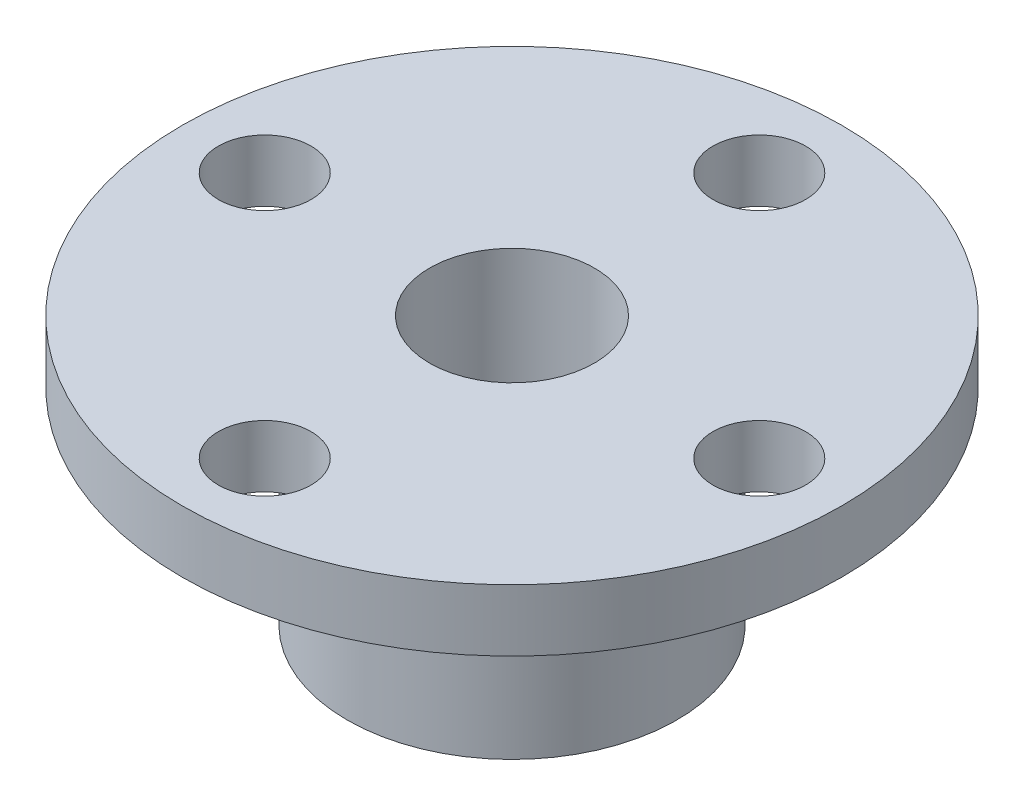
ISO-10303-21;
HEADER;
FILE_DESCRIPTION(('STEP AP214'),'2;1');
FILE_NAME('part.step','',(''),(''),'','','');
FILE_SCHEMA(('AUTOMOTIVE_DESIGN { 1 0 10303 214 1 1 1 1 }'));
ENDSEC;
DATA;
#1=APPLICATION_CONTEXT('core data for automotive mechanical design processes');
#2=APPLICATION_PROTOCOL_DEFINITION('international standard','automotive_design',2000,#1);
#3=PRODUCT_CONTEXT('',#1,'mechanical');
#4=PRODUCT('Part','Part','',(#3));
#5=PRODUCT_RELATED_PRODUCT_CATEGORY('part','',(#4));
#6=PRODUCT_DEFINITION_FORMATION('','',#4);
#7=PRODUCT_DEFINITION_CONTEXT('part definition',#1,'design');
#8=PRODUCT_DEFINITION('design','',#6,#7);
#9=PRODUCT_DEFINITION_SHAPE('','',#8);
#10=(LENGTH_UNIT() NAMED_UNIT(*) SI_UNIT(.MILLI.,.METRE.));
#11=(NAMED_UNIT(*) PLANE_ANGLE_UNIT() SI_UNIT($,.RADIAN.));
#12=(NAMED_UNIT(*) SI_UNIT($,.STERADIAN.) SOLID_ANGLE_UNIT());
#13=UNCERTAINTY_MEASURE_WITH_UNIT(LENGTH_MEASURE(1.E-05),#10,'distance_accuracy_value','');
#14=(GEOMETRIC_REPRESENTATION_CONTEXT(3) GLOBAL_UNCERTAINTY_ASSIGNED_CONTEXT((#13)) GLOBAL_UNIT_ASSIGNED_CONTEXT((#10,
#11,#12)) REPRESENTATION_CONTEXT('',''));
#15=CARTESIAN_POINT('',(0.,0.,0.));
#16=DIRECTION('',(0.,0.,1.));
#17=DIRECTION('',(1.,0.,0.));
#18=AXIS2_PLACEMENT_3D('',#15,#16,#17);
#19=CARTESIAN_POINT('',(0.,-5.,0.));
#20=DIRECTION('',(0.,1.,0.));
#21=DIRECTION('',(0.,0.,1.));
#22=AXIS2_PLACEMENT_3D('',#19,#20,#21);
#23=PLANE('',#22);
#24=CARTESIAN_POINT('',(0.,-5.,0.));
#25=DIRECTION('',(0.,1.,0.));
#26=DIRECTION('',(0.,0.,1.));
#27=AXIS2_PLACEMENT_3D('',#24,#25,#26);
#28=CIRCLE('',#27,8.);
#29=CARTESIAN_POINT('',(0.,-5.,8.));
#30=VERTEX_POINT('',#29);
#31=EDGE_CURVE('E45',#30,#30,#28,.T.);
#32=ORIENTED_EDGE('',*,*,#31,.F.);
#33=EDGE_LOOP('',(#32));
#34=FACE_BOUND('',#33,.T.);
#35=CARTESIAN_POINT('',(0.,-5.,0.));
#36=DIRECTION('',(0.,1.,0.));
#37=DIRECTION('',(0.,0.,1.));
#38=AXIS2_PLACEMENT_3D('',#35,#36,#37);
#39=CIRCLE('',#38,4.);
#40=CARTESIAN_POINT('',(0.,-5.,4.));
#41=VERTEX_POINT('',#40);
#42=EDGE_CURVE('E52',#41,#41,#39,.T.);
#43=ORIENTED_EDGE('',*,*,#42,.T.);
#44=EDGE_LOOP('',(#43));
#45=FACE_BOUND('',#44,.T.);
#46=ADVANCED_FACE('F40',(#34,#45),#23,.F.);
#47=CARTESIAN_POINT('',(0.,5.,0.));
#48=DIRECTION('',(0.,-1.,0.));
#49=DIRECTION('',(0.,0.,-1.));
#50=AXIS2_PLACEMENT_3D('',#47,#48,#49);
#51=CYLINDRICAL_SURFACE('',#50,8.);
#52=CARTESIAN_POINT('',(-7.82799463464303,0.,1.64999999999999));
#53=CARTESIAN_POINT('',(-7.82799647234762,-0.0916173497941295,1.64999668532493));
#54=CARTESIAN_POINT('',(-7.82962054015776,-0.183275814752847,1.64234339972764));
#55=CARTESIAN_POINT('',(-7.83593102109728,-0.363995369085821,1.61196056082935));
#56=CARTESIAN_POINT('',(-7.84061980768031,-0.453054389446515,1.58921932254547));
#57=CARTESIAN_POINT('',(-7.85250661788931,-0.625934492204627,1.52939944297714));
#58=CARTESIAN_POINT('',(-7.85970206178508,-0.709760855612775,1.49233553761891));
#59=CARTESIAN_POINT('',(-7.8757883628587,-0.870004602264868,1.40496339378156));
#60=CARTESIAN_POINT('',(-7.88467914491256,-0.946422313575551,1.35465574212316));
#61=CARTESIAN_POINT('',(-7.90330366333984,-1.09083130314561,1.24141806188275));
#62=CARTESIAN_POINT('',(-7.91304715328143,-1.15869500128047,1.17832691131059));
#63=CARTESIAN_POINT('',(-7.93219354684102,-1.28295461376032,1.04166118718968));
#64=CARTESIAN_POINT('',(-7.9415964257225,-1.33934969657567,0.968085854144701));
#65=CARTESIAN_POINT('',(-7.95910768239297,-1.43956942635827,0.811692001393454));
#66=CARTESIAN_POINT('',(-7.9672032148807,-1.48327235381807,0.728793920101064));
#67=CARTESIAN_POINT('',(-7.98107786735649,-1.55608110943423,0.556636173632879));
#68=CARTESIAN_POINT('',(-7.9868572180665,-1.58518839158008,0.467377143134516));
#69=CARTESIAN_POINT('',(-7.99537941797959,-1.62758111250497,0.286356118265319));
#70=CARTESIAN_POINT('',(-7.99816360714569,-1.64108215209675,0.194646593521389));
#71=CARTESIAN_POINT('',(-8.00052470522147,-1.65255227142173,0.010224791921826));
#72=CARTESIAN_POINT('',(-8.00010194196704,-1.65052293877214,-0.0824873814688684));
#73=CARTESIAN_POINT('',(-7.9961286601365,-1.63115248809589,-0.264799667160884));
#74=CARTESIAN_POINT('',(-7.99262559257093,-1.61404365512093,-0.35442564460906));
#75=CARTESIAN_POINT('',(-7.98293899531616,-1.5653688535758,-0.529506535845924));
#76=CARTESIAN_POINT('',(-7.97675535366161,-1.53380228111471,-0.614961275239551));
#77=CARTESIAN_POINT('',(-7.96232481023259,-1.45689604030914,-0.779930808135333));
#78=CARTESIAN_POINT('',(-7.95406448397429,-1.411466330109,-0.859402403191199));
#79=CARTESIAN_POINT('',(-7.93638961806161,-1.30819018594217,-1.00967984091354));
#80=CARTESIAN_POINT('',(-7.92697493766869,-1.25034223730045,-1.08048462481769));
#81=CARTESIAN_POINT('',(-7.9078239642189,-1.12260050730487,-1.21279807501824));
#82=CARTESIAN_POINT('',(-7.89808494418976,-1.05250342398988,-1.27411022634264));
#83=CARTESIAN_POINT('',(-7.87954771497238,-0.902922954740923,-1.38414252261934));
#84=CARTESIAN_POINT('',(-7.87074952591437,-0.823439368047681,-1.43286239817597));
#85=CARTESIAN_POINT('',(-7.85508413098618,-0.657048454677042,-1.51640121308694));
#86=CARTESIAN_POINT('',(-7.84822159457677,-0.570123824446947,-1.55118662114807));
#87=CARTESIAN_POINT('',(-7.83727167258975,-0.391488891774126,-1.60559987539904));
#88=CARTESIAN_POINT('',(-7.83318390018328,-0.299779258327424,-1.62522983445703));
#89=CARTESIAN_POINT('',(-7.82832430034404,-0.11596343547278,-1.64847767759947));
#90=CARTESIAN_POINT('',(-7.82749355348184,-0.023894750850637,-1.65238010858406));
#91=CARTESIAN_POINT('',(-7.8290836566982,0.159577873693995,-1.64482933127385));
#92=CARTESIAN_POINT('',(-7.83150430988348,0.250981853531663,-1.63337705280605));
#93=CARTESIAN_POINT('',(-7.83926913983493,0.429562925706313,-1.59568777426686));
#94=CARTESIAN_POINT('',(-7.84458293687796,0.516773866309524,-1.56960432546508));
#95=CARTESIAN_POINT('',(-7.85750843647708,0.685587763262813,-1.50355797289372));
#96=CARTESIAN_POINT('',(-7.8651203384623,0.767190232155915,-1.46359386451765));
#97=CARTESIAN_POINT('',(-7.88191579950282,0.923711451842274,-1.37028211396986));
#98=CARTESIAN_POINT('',(-7.89111960565472,0.998522375495671,-1.31675731908659));
#99=CARTESIAN_POINT('',(-7.91000699478186,1.13820452380131,-1.19807829347332));
#100=CARTESIAN_POINT('',(-7.91969063034348,1.20307465580095,-1.1329227860428));
#101=CARTESIAN_POINT('',(-7.93863877717957,1.32212093769425,-0.991551131023629));
#102=CARTESIAN_POINT('',(-7.94789380519354,1.37610416985807,-0.915171051258587));
#103=CARTESIAN_POINT('',(-7.96477402593325,1.47047228277745,-0.754260738130266));
#104=CARTESIAN_POINT('',(-7.97239928979603,1.51085775710128,-0.669730860728579));
#105=CARTESIAN_POINT('',(-7.98512048804082,1.57660680591843,-0.495414150876534));
#106=CARTESIAN_POINT('',(-7.99023131933467,1.60205903076799,-0.405661891513269));
#107=CARTESIAN_POINT('',(-7.99741186635557,1.63749875247808,-0.223039444294585));
#108=CARTESIAN_POINT('',(-7.99948197278732,1.64748823616509,-0.130169658580921));
#109=CARTESIAN_POINT('',(-8.00033781964049,1.65163792775637,0.0542126492055747));
#110=CARTESIAN_POINT('',(-7.99918360281958,1.64608751248278,0.145718502140299));
#111=CARTESIAN_POINT('',(-7.99384751004402,1.61995660490955,0.326463478938167));
#112=CARTESIAN_POINT('',(-7.98966567723011,1.59937632677157,0.415702635080897));
#113=CARTESIAN_POINT('',(-7.97874682116246,1.5439018588418,0.589186560182794));
#114=CARTESIAN_POINT('',(-7.97201637401338,1.509044489013,0.673443542985805));
#115=CARTESIAN_POINT('',(-7.95672300876336,1.42604295789362,0.834953513276949));
#116=CARTESIAN_POINT('',(-7.9481599348062,1.37789766642748,0.912205904261776));
#117=CARTESIAN_POINT('',(-7.92995681960444,1.26872135471439,1.05893847166513));
#118=CARTESIAN_POINT('',(-7.92030089151861,1.20748443024996,1.12826349060999));
#119=CARTESIAN_POINT('',(-7.90109178015231,1.07428375835354,1.25575285452552));
#120=CARTESIAN_POINT('',(-7.89153862187157,1.00231746145462,1.31391453937944));
#121=CARTESIAN_POINT('',(-7.8734942340194,0.848698896172095,1.41807001635073));
#122=CARTESIAN_POINT('',(-7.86501660134749,0.76694399769159,1.46391490783103));
#123=CARTESIAN_POINT('',(-7.85025069483304,0.596737113830858,1.54114313624576));
#124=CARTESIAN_POINT('',(-7.84396047891661,0.508291154433198,1.57253930936729));
#125=CARTESIAN_POINT('',(-7.83550744278865,0.349732775697689,1.61404620798977));
#126=CARTESIAN_POINT('',(-7.83270799535493,0.280511051598966,1.62750420424828));
#127=CARTESIAN_POINT('',(-7.82895092043294,0.140867623455348,1.64548220150438));
#128=CARTESIAN_POINT('',(-7.82799322160417,0.0704459659967139,1.65000254870379));
#129=CARTESIAN_POINT('',(-7.82799463464303,0.,1.64999999999999));
#130=B_SPLINE_CURVE_WITH_KNOTS('',3,(#52,#53,#54,#55,#56,#57,#58,#59,#60,#61,#62,#63,#64,#65,
#66,#67,#68,#69,#70,#71,#72,#73,#74,#75,#76,#77,#78,#79,#80,#81,#82,#83,#84,#85,#86,#87,#88,#89,
#90,#91,#92,#93,#94,#95,#96,#97,#98,#99,#100,#101,#102,#103,#104,#105,#106,#107,#108,#109,#110,
#111,#112,#113,#114,#115,#116,#117,#118,#119,#120,#121,#122,#123,#124,#125,#126,#127,#128,#129),
.UNSPECIFIED.,.T.,.F.,(4,2,2,2,2,2,2,2,2,2,2,2,2,2,2,2,2,2,2,2,2,2,2,2,2,2,2,2,2,2,2,2,2,2,2,2,
2,2,4),(0.,0.274594036981749,0.549400984088786,0.823925944657621,1.09843874327276,
1.3766547467594,1.65489091505464,1.93571338943598,2.21650788327397,2.49337499570617,
2.77021380533169,3.04286128513493,3.31552015429503,3.58998907522695,3.86449149267072,
4.14407920367273,4.4236728956019,4.70393540521657,4.9841588355065,5.25928898855093,
5.53440248143716,5.80668132243981,6.07898379854718,6.35504561674318,6.6311377568341,
6.91175972338565,7.19236943866019,7.47129602001294,7.75018675877315,8.02391884651822,
8.29764703391013,8.57067368982019,8.84372357458458,9.1214337806041,9.39921008040027,
9.68020708192079,9.96095396255218,10.1721016499172,10.38324115827),.UNSPECIFIED.);
#131=CARTESIAN_POINT('',(-7.82799463464303,0.,1.64999999999999));
#132=VERTEX_POINT('',#131);
#133=EDGE_CURVE('E65',#132,#132,#130,.T.);
#134=ORIENTED_EDGE('',*,*,#133,.T.);
#135=EDGE_LOOP('',(#134));
#136=FACE_BOUND('',#135,.T.);
#137=CARTESIAN_POINT('',(0.,5.,0.));
#138=DIRECTION('',(0.,1.,0.));
#139=DIRECTION('',(0.,0.,1.));
#140=AXIS2_PLACEMENT_3D('',#137,#138,#139);
#141=CIRCLE('',#140,8.);
#142=CARTESIAN_POINT('',(0.,5.,8.));
#143=VERTEX_POINT('',#142);
#144=EDGE_CURVE('E10',#143,#143,#141,.T.);
#145=ORIENTED_EDGE('',*,*,#144,.F.);
#146=EDGE_LOOP('',(#145));
#147=FACE_BOUND('',#146,.T.);
#148=ORIENTED_EDGE('',*,*,#31,.T.);
#149=EDGE_LOOP('',(#148));
#150=FACE_BOUND('',#149,.T.);
#151=ADVANCED_FACE('F42',(#136,#147,#150),#51,.T.);
#152=CARTESIAN_POINT('',(0.,5.,0.));
#153=DIRECTION('',(0.,-1.,0.));
#154=DIRECTION('',(0.,0.,-1.));
#155=AXIS2_PLACEMENT_3D('',#152,#153,#154);
#156=CYLINDRICAL_SURFACE('',#155,4.);
#157=CARTESIAN_POINT('',(-3.64383040220041,0.,1.64999999999999));
#158=CARTESIAN_POINT('',(-3.64383945275153,-0.0880964802256832,1.64999056813102));
#159=CARTESIAN_POINT('',(-3.64707173267573,-0.176340431973593,1.64289989177357));
#160=CARTESIAN_POINT('',(-3.65959209124688,-0.350287061078879,1.61480845546373));
#161=CARTESIAN_POINT('',(-3.66889676295875,-0.435982100597602,1.59376957896339));
#162=CARTESIAN_POINT('',(-3.69231325052126,-0.602002938130631,1.53873536249637));
#163=CARTESIAN_POINT('',(-3.70640571161012,-0.682348820218596,1.50479212400173));
#164=CARTESIAN_POINT('',(-3.73778230052357,-0.836181766834222,1.42506535594206));
#165=CARTESIAN_POINT('',(-3.75506562873473,-0.909670542784033,1.37928479159595));
#166=CARTESIAN_POINT('',(-3.7920553041855,-1.0522286878465,1.27419856290371));
#167=CARTESIAN_POINT('',(-3.81184277704779,-1.1208292557802,1.21428518241359));
#168=CARTESIAN_POINT('',(-3.85094363418238,-1.24735477190876,1.08391072165482));
#169=CARTESIAN_POINT('',(-3.87025683535296,-1.30527565147222,1.01344563996364));
#170=CARTESIAN_POINT('',(-3.90721575035942,-1.41117137130186,0.860301943593378));
#171=CARTESIAN_POINT('',(-3.92475616703248,-1.45862093270615,0.777232390113587));
#172=CARTESIAN_POINT('',(-3.95520283117798,-1.5386701453217,0.603436361875854));
#173=CARTESIAN_POINT('',(-3.96811109652272,-1.57127626434656,0.512713242513042));
#174=CARTESIAN_POINT('',(-3.98726403378776,-1.61902070665622,0.331105172304396));
#175=CARTESIAN_POINT('',(-3.99381564337609,-1.63496684792323,0.24046562518449));
#176=CARTESIAN_POINT('',(-4.0006306156112,-1.65154665185517,0.057576355149864));
#177=CARTESIAN_POINT('',(-4.00089647540932,-1.65218639532201,-0.0346727137709561));
#178=CARTESIAN_POINT('',(-3.99529224160632,-1.6385635038634,-0.212297380895986));
#179=CARTESIAN_POINT('',(-3.98978733384658,-1.6251878162829,-0.297754665400397));
#180=CARTESIAN_POINT('',(-3.97375926025944,-1.58543118255224,-0.465085845235279));
#181=CARTESIAN_POINT('',(-3.96323572489496,-1.55904927870932,-0.546959476205492));
#182=CARTESIAN_POINT('',(-3.93798907731603,-1.49371233827982,-0.706295606817228));
#183=CARTESIAN_POINT('',(-3.92320447216362,-1.45457201007513,-0.783671979762468));
#184=CARTESIAN_POINT('',(-3.89088763760773,-1.36500872081339,-0.930960489992464));
#185=CARTESIAN_POINT('',(-3.87335444442337,-1.31458179949669,-1.00086999453932));
#186=CARTESIAN_POINT('',(-3.83587133640027,-1.19981176097136,-1.1363853094704));
#187=CARTESIAN_POINT('',(-3.8158381454309,-1.13474658910127,-1.20135746318645));
#188=CARTESIAN_POINT('',(-3.77653142784555,-0.994590333678423,-1.31973838423493));
#189=CARTESIAN_POINT('',(-3.75725818494773,-0.919495550736696,-1.37314286572201));
#190=CARTESIAN_POINT('',(-3.7210660715691,-0.758401596452683,-1.46845339844828));
#191=CARTESIAN_POINT('',(-3.70424107982558,-0.672132428307348,-1.50994179309276));
#192=CARTESIAN_POINT('',(-3.67596385006486,-0.492953328594103,-1.57754508127095));
#193=CARTESIAN_POINT('',(-3.66450786071418,-0.400048086126183,-1.60367071206121));
#194=CARTESIAN_POINT('',(-3.64919091711419,-0.216577104815015,-1.63821320355941));
#195=CARTESIAN_POINT('',(-3.64489111171832,-0.12624169881714,-1.64765569454681));
#196=CARTESIAN_POINT('',(-3.64311980380968,0.0548056296985975,-1.65157101672826));
#197=CARTESIAN_POINT('',(-3.6456460160745,0.145517416059282,-1.64604885780401));
#198=CARTESIAN_POINT('',(-3.65678944366161,0.31880100904947,-1.62112710501826));
#199=CARTESIAN_POINT('',(-3.66501803861665,0.401528179674606,-1.60261202118542));
#200=CARTESIAN_POINT('',(-3.68614612916707,0.56263706437997,-1.55339580262014));
#201=CARTESIAN_POINT('',(-3.69904670212357,0.641017771351657,-1.52269185697123));
#202=CARTESIAN_POINT('',(-3.72872477858183,0.794879005695635,-1.44853902204984));
#203=CARTESIAN_POINT('',(-3.74564214050945,0.870100194779243,-1.40460979308263));
#204=CARTESIAN_POINT('',(-3.78124523189864,1.01246016942973,-1.30573455409451));
#205=CARTESIAN_POINT('',(-3.79993171387674,1.07959548773512,-1.25078384473683));
#206=CARTESIAN_POINT('',(-3.83876011670653,1.20942962644671,-1.12627542162098));
#207=CARTESIAN_POINT('',(-3.85889967217623,1.27135173704871,-1.05590387126703));
#208=CARTESIAN_POINT('',(-3.89698114804694,1.38264285566206,-0.9052979800801));
#209=CARTESIAN_POINT('',(-3.91492292631237,1.43201105200319,-0.8250630020269));
#210=CARTESIAN_POINT('',(-3.94668767391886,1.51670413420678,-0.656516816883264));
#211=CARTESIAN_POINT('',(-3.96050313975064,1.55200347500272,-0.568191273870488));
#212=CARTESIAN_POINT('',(-3.98237104121021,1.60699165685874,-0.386140833605175));
#213=CARTESIAN_POINT('',(-3.9904268305481,1.62668958293893,-0.292419112817558));
#214=CARTESIAN_POINT('',(-3.9994889299446,1.64878822892048,-0.109187189544834));
#215=CARTESIAN_POINT('',(-4.00094173424749,1.65228482874193,-0.019830308118634));
#216=CARTESIAN_POINT('',(-3.99786220239438,1.64481456562971,0.158161739195412));
#217=CARTESIAN_POINT('',(-3.99333087896147,1.63385015000454,0.24679702464848));
#218=CARTESIAN_POINT('',(-3.979024148364,1.59855535786443,0.417705375935875));
#219=CARTESIAN_POINT('',(-3.96943363922013,1.57469555788544,0.50009237162785));
#220=CARTESIAN_POINT('',(-3.94605480923816,1.51479588512,0.659667355734158));
#221=CARTESIAN_POINT('',(-3.93226568297163,1.47875367521331,0.736854343148742));
#222=CARTESIAN_POINT('',(-3.90105808483759,1.39369547331361,0.887661133732617));
#223=CARTESIAN_POINT('',(-3.8835042391169,1.34416874322707,0.960964214361148));
#224=CARTESIAN_POINT('',(-3.84685709666619,1.23429715321,1.09852932170704));
#225=CARTESIAN_POINT('',(-3.82776324400832,1.17394837691919,1.1627880603165));
#226=CARTESIAN_POINT('',(-3.78859741195738,1.03941247264534,1.28487769945047));
#227=CARTESIAN_POINT('',(-3.76854475207572,0.964572243115057,1.34199767947156));
#228=CARTESIAN_POINT('',(-3.73105419200534,0.805734024318929,1.4429647467733));
#229=CARTESIAN_POINT('',(-3.7136177396712,0.721731008290406,1.48680449811903));
#230=CARTESIAN_POINT('',(-3.68370387904713,0.547271558730101,1.55944447766651));
#231=CARTESIAN_POINT('',(-3.67119480418034,0.4568608919089,1.58834112875233));
#232=CARTESIAN_POINT('',(-3.65281837075147,0.271952855921639,1.63017263567572));
#233=CARTESIAN_POINT('',(-3.64692873900432,0.177470309123126,1.64316103312974));
#234=CARTESIAN_POINT('',(-3.6441405441978,0.0551366863573538,1.64931209329419));
#235=CARTESIAN_POINT('',(-3.64382756923723,0.0275755677149814,1.6500029523216));
#236=CARTESIAN_POINT('',(-3.64383040220041,0.,1.64999999999999));
#237=B_SPLINE_CURVE_WITH_KNOTS('',3,(#157,#158,#159,#160,#161,#162,#163,#164,#165,#166,#167,
#168,#169,#170,#171,#172,#173,#174,#175,#176,#177,#178,#179,#180,#181,#182,#183,#184,#185,#186,
#187,#188,#189,#190,#191,#192,#193,#194,#195,#196,#197,#198,#199,#200,#201,#202,#203,#204,#205,
#206,#207,#208,#209,#210,#211,#212,#213,#214,#215,#216,#217,#218,#219,#220,#221,#222,#223,#224,
#225,#226,#227,#228,#229,#230,#231,#232,#233,#234,#235,#236),.UNSPECIFIED.,.T.,.F.,(4,2,2,2,2,2,
2,2,2,2,2,2,2,2,2,2,2,2,2,2,2,2,2,2,2,2,2,2,2,2,2,2,2,2,2,2,2,2,2,4),(0.,0.264211724660743,
0.529148459018596,0.793026677872046,1.05683885985755,1.33523297260791,1.61373292676209,
1.90403076094908,2.19420198072698,2.46953816244269,2.74476495901023,3.00356896819765,
3.2623920368679,3.52515526924739,3.78801084539544,4.06907613148063,4.35024537535723,
4.64031806272422,4.93018777241109,5.20152035698261,5.4727621157604,5.72713321026164,
5.98156300028879,6.24665916965706,6.51186861189121,6.79815687284344,7.08446363898861,
7.37128791456168,7.65794504349148,7.92489841526077,8.19180661499932,8.44957452423756,
8.70739191275385,8.97680852354692,9.24632283025304,9.53374725602172,9.82133016535512,
10.1070334851925,10.3917725616093,10.4744749384331),.UNSPECIFIED.);
#238=CARTESIAN_POINT('',(-3.64383040220041,0.,1.64999999999999));
#239=VERTEX_POINT('',#238);
#240=EDGE_CURVE('E72',#239,#239,#237,.T.);
#241=ORIENTED_EDGE('',*,*,#240,.F.);
#242=EDGE_LOOP('',(#241));
#243=FACE_BOUND('',#242,.T.);
#244=ORIENTED_EDGE('',*,*,#42,.F.);
#245=EDGE_LOOP('',(#244));
#246=FACE_BOUND('',#245,.T.);
#247=CARTESIAN_POINT('',(0.,8.,0.));
#248=DIRECTION('',(0.,1.,0.));
#249=DIRECTION('',(0.,0.,1.));
#250=AXIS2_PLACEMENT_3D('',#247,#248,#249);
#251=CIRCLE('',#250,4.);
#252=CARTESIAN_POINT('',(0.,8.,4.));
#253=VERTEX_POINT('',#252);
#254=EDGE_CURVE('E60',#253,#253,#251,.T.);
#255=ORIENTED_EDGE('',*,*,#254,.T.);
#256=EDGE_LOOP('',(#255));
#257=FACE_BOUND('',#256,.T.);
#258=ADVANCED_FACE('F93',(#243,#246,#257),#156,.F.);
#259=CARTESIAN_POINT('',(0.,8.,0.));
#260=DIRECTION('',(0.,1.,0.));
#261=DIRECTION('',(0.,0.,1.));
#262=AXIS2_PLACEMENT_3D('',#259,#260,#261);
#263=PLANE('',#262);
#264=CARTESIAN_POINT('',(0.,8.,-12.));
#265=DIRECTION('',(0.,1.,0.));
#266=DIRECTION('',(0.,0.,1.));
#267=AXIS2_PLACEMENT_3D('',#264,#265,#266);
#268=CIRCLE('',#267,2.25);
#269=CARTESIAN_POINT('',(0.,8.,-9.75));
#270=VERTEX_POINT('',#269);
#271=EDGE_CURVE('E214',#270,#270,#268,.T.);
#272=ORIENTED_EDGE('',*,*,#271,.F.);
#273=EDGE_LOOP('',(#272));
#274=FACE_BOUND('',#273,.T.);
#275=CARTESIAN_POINT('',(12.,8.,0.));
#276=DIRECTION('',(0.,1.,0.));
#277=DIRECTION('',(0.,0.,1.));
#278=AXIS2_PLACEMENT_3D('',#275,#276,#277);
#279=CIRCLE('',#278,2.25);
#280=CARTESIAN_POINT('',(12.,8.,2.25));
#281=VERTEX_POINT('',#280);
#282=EDGE_CURVE('E216',#281,#281,#279,.T.);
#283=ORIENTED_EDGE('',*,*,#282,.F.);
#284=EDGE_LOOP('',(#283));
#285=FACE_BOUND('',#284,.T.);
#286=CARTESIAN_POINT('',(-12.,8.,0.));
#287=DIRECTION('',(0.,1.,0.));
#288=DIRECTION('',(0.,0.,1.));
#289=AXIS2_PLACEMENT_3D('',#286,#287,#288);
#290=CIRCLE('',#289,2.25);
#291=CARTESIAN_POINT('',(-12.,8.,2.25));
#292=VERTEX_POINT('',#291);
#293=EDGE_CURVE('E224',#292,#292,#290,.T.);
#294=ORIENTED_EDGE('',*,*,#293,.F.);
#295=EDGE_LOOP('',(#294));
#296=FACE_BOUND('',#295,.T.);
#297=CARTESIAN_POINT('',(0.,8.,12.));
#298=DIRECTION('',(0.,1.,0.));
#299=DIRECTION('',(0.,0.,1.));
#300=AXIS2_PLACEMENT_3D('',#297,#298,#299);
#301=CIRCLE('',#300,2.25);
#302=CARTESIAN_POINT('',(0.,8.,14.25));
#303=VERTEX_POINT('',#302);
#304=EDGE_CURVE('E230',#303,#303,#301,.T.);
#305=ORIENTED_EDGE('',*,*,#304,.F.);
#306=EDGE_LOOP('',(#305));
#307=FACE_BOUND('',#306,.T.);
#308=CARTESIAN_POINT('',(0.,8.,0.));
#309=DIRECTION('',(0.,1.,0.));
#310=DIRECTION('',(0.,0.,1.));
#311=AXIS2_PLACEMENT_3D('',#308,#309,#310);
#312=CIRCLE('',#311,16.);
#313=CARTESIAN_POINT('',(0.,8.,16.));
#314=VERTEX_POINT('',#313);
#315=EDGE_CURVE('E56',#314,#314,#312,.T.);
#316=ORIENTED_EDGE('',*,*,#315,.T.);
#317=EDGE_LOOP('',(#316));
#318=FACE_BOUND('',#317,.T.);
#319=ORIENTED_EDGE('',*,*,#254,.F.);
#320=EDGE_LOOP('',(#319));
#321=FACE_BOUND('',#320,.T.);
#322=ADVANCED_FACE('F89',(#274,#285,#296,#307,#318,#321),#263,.T.);
#323=CARTESIAN_POINT('',(0.,5.,0.));
#324=DIRECTION('',(0.,1.,0.));
#325=DIRECTION('',(0.,0.,1.));
#326=AXIS2_PLACEMENT_3D('',#323,#324,#325);
#327=PLANE('',#326);
#328=CARTESIAN_POINT('',(0.,5.,-12.));
#329=DIRECTION('',(0.,1.,0.));
#330=DIRECTION('',(0.,0.,1.));
#331=AXIS2_PLACEMENT_3D('',#328,#329,#330);
#332=CIRCLE('',#331,2.25);
#333=CARTESIAN_POINT('',(0.,5.,-9.75));
#334=VERTEX_POINT('',#333);
#335=EDGE_CURVE('E211',#334,#334,#332,.T.);
#336=ORIENTED_EDGE('',*,*,#335,.T.);
#337=EDGE_LOOP('',(#336));
#338=FACE_BOUND('',#337,.T.);
#339=CARTESIAN_POINT('',(12.,5.,0.));
#340=DIRECTION('',(0.,1.,0.));
#341=DIRECTION('',(0.,0.,1.));
#342=AXIS2_PLACEMENT_3D('',#339,#340,#341);
#343=CIRCLE('',#342,2.25);
#344=CARTESIAN_POINT('',(12.,5.,2.25));
#345=VERTEX_POINT('',#344);
#346=EDGE_CURVE('E221',#345,#345,#343,.T.);
#347=ORIENTED_EDGE('',*,*,#346,.T.);
#348=EDGE_LOOP('',(#347));
#349=FACE_BOUND('',#348,.T.);
#350=CARTESIAN_POINT('',(-12.,5.,0.));
#351=DIRECTION('',(0.,1.,0.));
#352=DIRECTION('',(0.,0.,1.));
#353=AXIS2_PLACEMENT_3D('',#350,#351,#352);
#354=CIRCLE('',#353,2.25);
#355=CARTESIAN_POINT('',(-12.,5.,2.25));
#356=VERTEX_POINT('',#355);
#357=EDGE_CURVE('E227',#356,#356,#354,.T.);
#358=ORIENTED_EDGE('',*,*,#357,.T.);
#359=EDGE_LOOP('',(#358));
#360=FACE_BOUND('',#359,.T.);
#361=CARTESIAN_POINT('',(0.,5.,12.));
#362=DIRECTION('',(0.,1.,0.));
#363=DIRECTION('',(0.,0.,1.));
#364=AXIS2_PLACEMENT_3D('',#361,#362,#363);
#365=CIRCLE('',#364,2.25);
#366=CARTESIAN_POINT('',(0.,5.,14.25));
#367=VERTEX_POINT('',#366);
#368=EDGE_CURVE('E232',#367,#367,#365,.T.);
#369=ORIENTED_EDGE('',*,*,#368,.T.);
#370=EDGE_LOOP('',(#369));
#371=FACE_BOUND('',#370,.T.);
#372=ORIENTED_EDGE('',*,*,#144,.T.);
#373=EDGE_LOOP('',(#372));
#374=FACE_BOUND('',#373,.T.);
#375=CARTESIAN_POINT('',(0.,5.,0.));
#376=DIRECTION('',(0.,1.,0.));
#377=DIRECTION('',(0.,0.,1.));
#378=AXIS2_PLACEMENT_3D('',#375,#376,#377);
#379=CIRCLE('',#378,16.);
#380=CARTESIAN_POINT('',(0.,5.,16.));
#381=VERTEX_POINT('',#380);
#382=EDGE_CURVE('E57',#381,#381,#379,.T.);
#383=ORIENTED_EDGE('',*,*,#382,.F.);
#384=EDGE_LOOP('',(#383));
#385=FACE_BOUND('',#384,.T.);
#386=ADVANCED_FACE('F92',(#338,#349,#360,#371,#374,#385),#327,.F.);
#387=CARTESIAN_POINT('',(0.,8.,0.));
#388=DIRECTION('',(0.,-1.,0.));
#389=DIRECTION('',(0.,0.,-1.));
#390=AXIS2_PLACEMENT_3D('',#387,#388,#389);
#391=CYLINDRICAL_SURFACE('',#390,16.);
#392=ORIENTED_EDGE('',*,*,#315,.F.);
#393=EDGE_LOOP('',(#392));
#394=FACE_BOUND('',#393,.T.);
#395=ORIENTED_EDGE('',*,*,#382,.T.);
#396=EDGE_LOOP('',(#395));
#397=FACE_BOUND('',#396,.T.);
#398=ADVANCED_FACE('F83',(#394,#397),#391,.T.);
#399=CARTESIAN_POINT('',(-8.,0.,0.));
#400=DIRECTION('',(-1.,0.,0.));
#401=DIRECTION('',(0.,0.,1.));
#402=AXIS2_PLACEMENT_3D('',#399,#400,#401);
#403=CYLINDRICAL_SURFACE('',#402,1.64999999999999);
#404=ORIENTED_EDGE('',*,*,#240,.T.);
#405=EDGE_LOOP('',(#404));
#406=FACE_BOUND('',#405,.T.);
#407=ORIENTED_EDGE('',*,*,#133,.F.);
#408=EDGE_LOOP('',(#407));
#409=FACE_BOUND('',#408,.T.);
#410=ADVANCED_FACE('F78',(#406,#409),#403,.F.);
#411=CARTESIAN_POINT('',(0.,8.,12.));
#412=DIRECTION('',(0.,1.,0.));
#413=DIRECTION('',(0.,0.,1.));
#414=AXIS2_PLACEMENT_3D('',#411,#412,#413);
#415=CYLINDRICAL_SURFACE('',#414,2.25);
#416=ORIENTED_EDGE('',*,*,#368,.F.);
#417=EDGE_LOOP('',(#416));
#418=FACE_BOUND('',#417,.T.);
#419=ORIENTED_EDGE('',*,*,#304,.T.);
#420=EDGE_LOOP('',(#419));
#421=FACE_BOUND('',#420,.T.);
#422=ADVANCED_FACE('F82',(#418,#421),#415,.F.);
#423=CARTESIAN_POINT('',(-12.,8.,0.));
#424=DIRECTION('',(0.,1.,0.));
#425=DIRECTION('',(0.,0.,1.));
#426=AXIS2_PLACEMENT_3D('',#423,#424,#425);
#427=CYLINDRICAL_SURFACE('',#426,2.25);
#428=ORIENTED_EDGE('',*,*,#357,.F.);
#429=EDGE_LOOP('',(#428));
#430=FACE_BOUND('',#429,.T.);
#431=ORIENTED_EDGE('',*,*,#293,.T.);
#432=EDGE_LOOP('',(#431));
#433=FACE_BOUND('',#432,.T.);
#434=ADVANCED_FACE('F149',(#430,#433),#427,.F.);
#435=CARTESIAN_POINT('',(12.,8.,0.));
#436=DIRECTION('',(0.,1.,0.));
#437=DIRECTION('',(0.,0.,1.));
#438=AXIS2_PLACEMENT_3D('',#435,#436,#437);
#439=CYLINDRICAL_SURFACE('',#438,2.25);
#440=ORIENTED_EDGE('',*,*,#346,.F.);
#441=EDGE_LOOP('',(#440));
#442=FACE_BOUND('',#441,.T.);
#443=ORIENTED_EDGE('',*,*,#282,.T.);
#444=EDGE_LOOP('',(#443));
#445=FACE_BOUND('',#444,.T.);
#446=ADVANCED_FACE('F156',(#442,#445),#439,.F.);
#447=CARTESIAN_POINT('',(0.,8.,-12.));
#448=DIRECTION('',(0.,1.,0.));
#449=DIRECTION('',(0.,0.,1.));
#450=AXIS2_PLACEMENT_3D('',#447,#448,#449);
#451=CYLINDRICAL_SURFACE('',#450,2.25);
#452=ORIENTED_EDGE('',*,*,#335,.F.);
#453=EDGE_LOOP('',(#452));
#454=FACE_BOUND('',#453,.T.);
#455=ORIENTED_EDGE('',*,*,#271,.T.);
#456=EDGE_LOOP('',(#455));
#457=FACE_BOUND('',#456,.T.);
#458=ADVANCED_FACE('F163',(#454,#457),#451,.F.);
#459=CLOSED_SHELL('',(#46,#151,#258,#322,#386,#398,#410,#422,#434,#446,#458));
#460=MANIFOLD_SOLID_BREP('B2',#459);
#461=ADVANCED_BREP_SHAPE_REPRESENTATION('',(#18,#460),#14);
#462=SHAPE_DEFINITION_REPRESENTATION(#9,#461);
ENDSEC;
END-ISO-10303-21;
